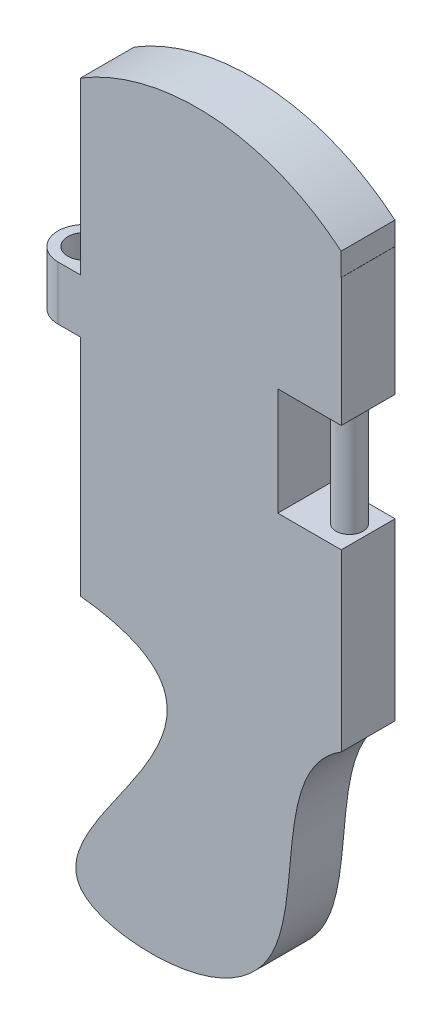
ISO-10303-21;
HEADER;
FILE_DESCRIPTION(('STEP AP214'),'2;1');
FILE_NAME('part.step','',(''),(''),'','','');
FILE_SCHEMA(('AUTOMOTIVE_DESIGN { 1 0 10303 214 1 1 1 1 }'));
ENDSEC;
DATA;
#1=APPLICATION_CONTEXT('core data for automotive mechanical design processes');
#2=APPLICATION_PROTOCOL_DEFINITION('international standard','automotive_design',2000,#1);
#3=PRODUCT_CONTEXT('',#1,'mechanical');
#4=PRODUCT('Part','Part','',(#3));
#5=PRODUCT_RELATED_PRODUCT_CATEGORY('part','',(#4));
#6=PRODUCT_DEFINITION_FORMATION('','',#4);
#7=PRODUCT_DEFINITION_CONTEXT('part definition',#1,'design');
#8=PRODUCT_DEFINITION('design','',#6,#7);
#9=PRODUCT_DEFINITION_SHAPE('','',#8);
#10=(LENGTH_UNIT() NAMED_UNIT(*) SI_UNIT(.MILLI.,.METRE.));
#11=(NAMED_UNIT(*) PLANE_ANGLE_UNIT() SI_UNIT($,.RADIAN.));
#12=(NAMED_UNIT(*) SI_UNIT($,.STERADIAN.) SOLID_ANGLE_UNIT());
#13=UNCERTAINTY_MEASURE_WITH_UNIT(LENGTH_MEASURE(1.E-05),#10,'distance_accuracy_value','');
#14=(GEOMETRIC_REPRESENTATION_CONTEXT(3) GLOBAL_UNCERTAINTY_ASSIGNED_CONTEXT((#13)) GLOBAL_UNIT_ASSIGNED_CONTEXT((#10,
#11,#12)) REPRESENTATION_CONTEXT('',''));
#15=CARTESIAN_POINT('',(0.,0.,0.));
#16=DIRECTION('',(0.,0.,1.));
#17=DIRECTION('',(1.,0.,0.));
#18=AXIS2_PLACEMENT_3D('',#15,#16,#17);
#19=CARTESIAN_POINT('',(0.,0.,6.));
#20=DIRECTION('',(1.,0.,0.));
#21=DIRECTION('',(0.,0.,-1.));
#22=AXIS2_PLACEMENT_3D('',#19,#20,#21);
#23=PLANE('',#22);
#24=DIRECTION('',(0.,0.,-1.));
#25=VECTOR('',#24,1.);
#26=CARTESIAN_POINT('',(0.,31.,0.));
#27=LINE('',#26,#25);
#28=CARTESIAN_POINT('',(0.,31.,6.));
#29=VERTEX_POINT('',#28);
#30=CARTESIAN_POINT('',(0.,31.,0.));
#31=VERTEX_POINT('',#30);
#32=EDGE_CURVE('E236',#29,#31,#27,.T.);
#33=ORIENTED_EDGE('',*,*,#32,.F.);
#34=DIRECTION('',(0.,-1.,0.));
#35=VECTOR('',#34,1.);
#36=CARTESIAN_POINT('',(0.,0.,6.));
#37=LINE('',#36,#35);
#38=CARTESIAN_POINT('',(0.,50.,6.));
#39=VERTEX_POINT('',#38);
#40=EDGE_CURVE('E278',#39,#29,#37,.T.);
#41=ORIENTED_EDGE('',*,*,#40,.F.);
#42=DIRECTION('',(0.,0.,-1.));
#43=VECTOR('',#42,1.);
#44=CARTESIAN_POINT('',(0.,50.,6.));
#45=LINE('',#44,#43);
#46=CARTESIAN_POINT('',(0.,50.,0.));
#47=VERTEX_POINT('',#46);
#48=EDGE_CURVE('E302',#39,#47,#45,.T.);
#49=ORIENTED_EDGE('',*,*,#48,.T.);
#50=DIRECTION('',(0.,-1.,0.));
#51=VECTOR('',#50,1.);
#52=CARTESIAN_POINT('',(0.,0.,0.));
#53=LINE('',#52,#51);
#54=EDGE_CURVE('E272',#47,#31,#53,.T.);
#55=ORIENTED_EDGE('',*,*,#54,.T.);
#56=EDGE_LOOP('',(#33,#41,#49,#55));
#57=FACE_BOUND('',#56,.T.);
#58=ADVANCED_FACE('F44',(#57),#23,.F.);
#59=CARTESIAN_POINT('',(0.,0.,6.));
#60=CARTESIAN_POINT('',(23.8721311751468,-2.7431632315194,6.));
#61=CARTESIAN_POINT('',(-15.1561208225905,-28.8207850670708,6.));
#62=CARTESIAN_POINT('',(12.5644821614038,-31.6224895801647,6.));
#63=CARTESIAN_POINT('',(27.1083698860684,-22.1343962257601,6.));
#64=CARTESIAN_POINT('',(20.6835352250907,-4.60988712947031,6.));
#65=CARTESIAN_POINT('',(30.,0.,6.));
#66=B_SPLINE_CURVE_WITH_KNOTS('',3,(#59,#60,#61,#62,#63,#64,#65),.UNSPECIFIED.,.F.,.F.,(4,1,1,1,
4),(0.,0.411785319319474,0.564960896964419,0.677132612613347,1.),.UNSPECIFIED.);
#67=DIRECTION('',(0.,0.,-1.));
#68=VECTOR('',#67,1.);
#69=SURFACE_OF_LINEAR_EXTRUSION('',#66,#68);
#70=CARTESIAN_POINT('',(0.,0.,0.));
#71=CARTESIAN_POINT('',(23.8721311751468,-2.7431632315194,0.));
#72=CARTESIAN_POINT('',(-15.1561208225905,-28.8207850670708,0.));
#73=CARTESIAN_POINT('',(12.5644821614038,-31.6224895801647,0.));
#74=CARTESIAN_POINT('',(27.1083698860684,-22.1343962257601,0.));
#75=CARTESIAN_POINT('',(20.6835352250907,-4.60988712947031,0.));
#76=CARTESIAN_POINT('',(30.,0.,0.));
#77=B_SPLINE_CURVE_WITH_KNOTS('',3,(#70,#71,#72,#73,#74,#75,#76),.UNSPECIFIED.,.F.,.F.,(4,1,1,1,
4),(0.,0.411785319319474,0.564960896964419,0.677132612613347,1.),.UNSPECIFIED.);
#78=CARTESIAN_POINT('',(0.,0.,0.));
#79=VERTEX_POINT('',#78);
#80=CARTESIAN_POINT('',(29.0752583291039,-0.51259095328322,0.));
#81=VERTEX_POINT('',#80);
#82=EDGE_CURVE('E262',#79,#81,#77,.T.);
#83=ORIENTED_EDGE('',*,*,#82,.T.);
#84=DIRECTION('',(0.,0.,-1.));
#85=VECTOR('',#84,1.);
#86=CARTESIAN_POINT('',(29.0752583291039,-0.51259095324341,6.));
#87=LINE('',#86,#85);
#88=CARTESIAN_POINT('',(29.0752583291039,-0.512590953283237,6.));
#89=VERTEX_POINT('',#88);
#90=EDGE_CURVE('E187',#81,#89,#87,.F.);
#91=ORIENTED_EDGE('',*,*,#90,.T.);
#92=CARTESIAN_POINT('',(0.,0.,6.));
#93=VERTEX_POINT('',#92);
#94=EDGE_CURVE('E264',#93,#89,#66,.T.);
#95=ORIENTED_EDGE('',*,*,#94,.F.);
#96=DIRECTION('',(0.,0.,-1.));
#97=VECTOR('',#96,1.);
#98=CARTESIAN_POINT('',(0.,0.,6.));
#99=LINE('',#98,#97);
#100=EDGE_CURVE('E283',#93,#79,#99,.T.);
#101=ORIENTED_EDGE('',*,*,#100,.T.);
#102=EDGE_LOOP('',(#83,#91,#95,#101));
#103=FACE_BOUND('',#102,.T.);
#104=ADVANCED_FACE('F50',(#103),#69,.F.);
#105=CARTESIAN_POINT('',(13.0155305968896,28.6553059688964,6.));
#106=DIRECTION('',(0.,0.,-1.));
#107=DIRECTION('',(-1.,0.,0.));
#108=AXIS2_PLACEMENT_3D('',#105,#106,#107);
#109=CYLINDRICAL_SURFACE('',#108,25.);
#110=CARTESIAN_POINT('',(13.0155305968896,28.6553059688964,6.));
#111=DIRECTION('',(0.,0.,1.));
#112=DIRECTION('',(-1.,0.,0.));
#113=AXIS2_PLACEMENT_3D('',#110,#111,#112);
#114=CIRCLE('',#113,25.);
#115=CARTESIAN_POINT('',(29.0595753531973,47.8279069363603,6.));
#116=VERTEX_POINT('',#115);
#117=EDGE_CURVE('E275',#116,#39,#114,.T.);
#118=ORIENTED_EDGE('',*,*,#117,.F.);
#119=DIRECTION('',(0.,0.,1.));
#120=VECTOR('',#119,1.);
#121=CARTESIAN_POINT('',(29.0595753531973,47.8279069363603,0.));
#122=LINE('',#121,#120);
#123=CARTESIAN_POINT('',(29.0595753531973,47.8279069363603,0.));
#124=VERTEX_POINT('',#123);
#125=EDGE_CURVE('E154',#124,#116,#122,.T.);
#126=ORIENTED_EDGE('',*,*,#125,.F.);
#127=CARTESIAN_POINT('',(13.0155305968896,28.6553059688964,0.));
#128=DIRECTION('',(0.,0.,1.));
#129=DIRECTION('',(-1.,0.,0.));
#130=AXIS2_PLACEMENT_3D('',#127,#128,#129);
#131=CIRCLE('',#130,25.);
#132=EDGE_CURVE('E170',#124,#47,#131,.T.);
#133=ORIENTED_EDGE('',*,*,#132,.T.);
#134=ORIENTED_EDGE('',*,*,#48,.F.);
#135=EDGE_LOOP('',(#118,#126,#133,#134));
#136=FACE_BOUND('',#135,.T.);
#137=ADVANCED_FACE('F354',(#136),#109,.T.);
#138=CARTESIAN_POINT('',(0.,25.,6.));
#139=VERTEX_POINT('',#138);
#140=EDGE_CURVE('E276',#139,#93,#37,.T.);
#141=ORIENTED_EDGE('',*,*,#140,.F.);
#142=DIRECTION('',(0.,0.,-1.));
#143=VECTOR('',#142,1.);
#144=CARTESIAN_POINT('',(0.,25.,0.));
#145=LINE('',#144,#143);
#146=CARTESIAN_POINT('',(0.,25.,0.));
#147=VERTEX_POINT('',#146);
#148=EDGE_CURVE('E251',#139,#147,#145,.T.);
#149=ORIENTED_EDGE('',*,*,#148,.T.);
#150=EDGE_CURVE('E293',#147,#79,#53,.T.);
#151=ORIENTED_EDGE('',*,*,#150,.T.);
#152=ORIENTED_EDGE('',*,*,#100,.F.);
#153=EDGE_LOOP('',(#141,#149,#151,#152));
#154=FACE_BOUND('',#153,.T.);
#155=ADVANCED_FACE('F346',(#154),#23,.F.);
#156=CARTESIAN_POINT('',(6.33964307279283,-30.5103738589978,6.));
#157=DIRECTION('',(0.,0.,1.));
#158=DIRECTION('',(1.,0.,0.));
#159=AXIS2_PLACEMENT_3D('',#156,#157,#158);
#160=PLANE('',#159);
#161=DIRECTION('',(0.,-1.,0.));
#162=VECTOR('',#161,1.);
#163=CARTESIAN_POINT('',(29.0595753531973,47.8279069363603,6.));
#164=LINE('',#163,#162);
#165=CARTESIAN_POINT('',(29.0595753531973,45.2788571865023,6.));
#166=VERTEX_POINT('',#165);
#167=EDGE_CURVE('E153',#116,#166,#164,.T.);
#168=ORIENTED_EDGE('',*,*,#167,.F.);
#169=ORIENTED_EDGE('',*,*,#117,.T.);
#170=ORIENTED_EDGE('',*,*,#40,.T.);
#171=DIRECTION('',(1.,0.,0.));
#172=VECTOR('',#171,1.);
#173=CARTESIAN_POINT('',(-2.5,31.,6.00000000000001));
#174=LINE('',#173,#172);
#175=CARTESIAN_POINT('',(-2.5,31.,6.00000000000001));
#176=VERTEX_POINT('',#175);
#177=EDGE_CURVE('E233',#176,#29,#174,.T.);
#178=ORIENTED_EDGE('',*,*,#177,.F.);
#179=DIRECTION('',(0.,-1.,0.));
#180=VECTOR('',#179,1.);
#181=CARTESIAN_POINT('',(-2.5,31.,6.00000000000001));
#182=LINE('',#181,#180);
#183=CARTESIAN_POINT('',(-2.5,25.,6.00000000000001));
#184=VERTEX_POINT('',#183);
#185=EDGE_CURVE('E261',#176,#184,#182,.T.);
#186=ORIENTED_EDGE('',*,*,#185,.T.);
#187=DIRECTION('',(1.,0.,0.));
#188=VECTOR('',#187,1.);
#189=CARTESIAN_POINT('',(-2.5,25.,6.00000000000001));
#190=LINE('',#189,#188);
#191=EDGE_CURVE('E249',#184,#139,#190,.T.);
#192=ORIENTED_EDGE('',*,*,#191,.T.);
#193=ORIENTED_EDGE('',*,*,#140,.T.);
#194=ORIENTED_EDGE('',*,*,#94,.T.);
#195=DIRECTION('',(0.,-1.,0.));
#196=VECTOR('',#195,1.);
#197=CARTESIAN_POINT('',(29.0752583291039,47.,6.));
#198=LINE('',#197,#196);
#199=CARTESIAN_POINT('',(29.0752583291039,19.,6.));
#200=VERTEX_POINT('',#199);
#201=EDGE_CURVE('E177',#200,#89,#198,.T.);
#202=ORIENTED_EDGE('',*,*,#201,.F.);
#203=DIRECTION('',(1.,0.,0.));
#204=VECTOR('',#203,1.);
#205=CARTESIAN_POINT('',(30.,19.,6.));
#206=LINE('',#205,#204);
#207=CARTESIAN_POINT('',(22.,19.,6.));
#208=VERTEX_POINT('',#207);
#209=EDGE_CURVE('E198',#208,#200,#206,.T.);
#210=ORIENTED_EDGE('',*,*,#209,.F.);
#211=DIRECTION('',(0.,-1.,0.));
#212=VECTOR('',#211,1.);
#213=CARTESIAN_POINT('',(22.,31.,6.));
#214=LINE('',#213,#212);
#215=CARTESIAN_POINT('',(22.,31.,6.));
#216=VERTEX_POINT('',#215);
#217=EDGE_CURVE('E210',#216,#208,#214,.T.);
#218=ORIENTED_EDGE('',*,*,#217,.F.);
#219=DIRECTION('',(-1.,0.,0.));
#220=VECTOR('',#219,1.);
#221=CARTESIAN_POINT('',(30.,31.,6.));
#222=LINE('',#221,#220);
#223=CARTESIAN_POINT('',(29.0752583291039,31.,6.));
#224=VERTEX_POINT('',#223);
#225=EDGE_CURVE('E192',#224,#216,#222,.T.);
#226=ORIENTED_EDGE('',*,*,#225,.F.);
#227=CARTESIAN_POINT('',(29.0752583291039,45.2788571865023,6.));
#228=VERTEX_POINT('',#227);
#229=EDGE_CURVE('E178',#228,#224,#198,.T.);
#230=ORIENTED_EDGE('',*,*,#229,.F.);
#231=DIRECTION('',(1.,0.,0.));
#232=VECTOR('',#231,1.);
#233=CARTESIAN_POINT('',(29.0595753531973,45.2788571865023,6.));
#234=LINE('',#233,#232);
#235=EDGE_CURVE('E62',#166,#228,#234,.T.);
#236=ORIENTED_EDGE('',*,*,#235,.F.);
#237=EDGE_LOOP('',(#168,#169,#170,#178,#186,#192,#193,#194,#202,#210,#218,#226,#230,#236));
#238=FACE_BOUND('',#237,.T.);
#239=ADVANCED_FACE('F322',(#238),#160,.T.);
#240=CARTESIAN_POINT('',(6.33964307279283,-30.5103738589978,0.));
#241=DIRECTION('',(0.,0.,1.));
#242=DIRECTION('',(1.,0.,0.));
#243=AXIS2_PLACEMENT_3D('',#240,#241,#242);
#244=PLANE('',#243);
#245=ORIENTED_EDGE('',*,*,#132,.F.);
#246=DIRECTION('',(0.,-1.,0.));
#247=VECTOR('',#246,1.);
#248=CARTESIAN_POINT('',(29.0595753531973,47.8279069363603,0.));
#249=LINE('',#248,#247);
#250=CARTESIAN_POINT('',(29.0595753531973,45.2788571865023,0.));
#251=VERTEX_POINT('',#250);
#252=EDGE_CURVE('E147',#124,#251,#249,.T.);
#253=ORIENTED_EDGE('',*,*,#252,.T.);
#254=DIRECTION('',(1.,0.,0.));
#255=VECTOR('',#254,1.);
#256=CARTESIAN_POINT('',(29.0595753531973,45.2788571865023,0.));
#257=LINE('',#256,#255);
#258=CARTESIAN_POINT('',(29.0752583291039,45.2788571865023,0.));
#259=VERTEX_POINT('',#258);
#260=EDGE_CURVE('E156',#251,#259,#257,.T.);
#261=ORIENTED_EDGE('',*,*,#260,.T.);
#262=DIRECTION('',(0.,-1.,0.));
#263=VECTOR('',#262,1.);
#264=CARTESIAN_POINT('',(29.0752583291039,-30.5103738589978,0.));
#265=LINE('',#264,#263);
#266=CARTESIAN_POINT('',(29.0752583291039,31.,0.));
#267=VERTEX_POINT('',#266);
#268=EDGE_CURVE('E182',#259,#267,#265,.T.);
#269=ORIENTED_EDGE('',*,*,#268,.T.);
#270=DIRECTION('',(-1.,0.,0.));
#271=VECTOR('',#270,1.);
#272=CARTESIAN_POINT('',(30.,31.,0.));
#273=LINE('',#272,#271);
#274=CARTESIAN_POINT('',(22.,31.,0.));
#275=VERTEX_POINT('',#274);
#276=EDGE_CURVE('E195',#267,#275,#273,.T.);
#277=ORIENTED_EDGE('',*,*,#276,.T.);
#278=DIRECTION('',(0.,-1.,0.));
#279=VECTOR('',#278,1.);
#280=CARTESIAN_POINT('',(22.,31.,0.));
#281=LINE('',#280,#279);
#282=CARTESIAN_POINT('',(22.,19.,0.));
#283=VERTEX_POINT('',#282);
#284=EDGE_CURVE('E191',#275,#283,#281,.T.);
#285=ORIENTED_EDGE('',*,*,#284,.T.);
#286=DIRECTION('',(1.,0.,0.));
#287=VECTOR('',#286,1.);
#288=CARTESIAN_POINT('',(30.,19.,0.));
#289=LINE('',#288,#287);
#290=CARTESIAN_POINT('',(29.0752583291039,19.,0.));
#291=VERTEX_POINT('',#290);
#292=EDGE_CURVE('E199',#283,#291,#289,.T.);
#293=ORIENTED_EDGE('',*,*,#292,.T.);
#294=EDGE_CURVE('E69',#291,#81,#265,.T.);
#295=ORIENTED_EDGE('',*,*,#294,.T.);
#296=ORIENTED_EDGE('',*,*,#82,.F.);
#297=ORIENTED_EDGE('',*,*,#150,.F.);
#298=DIRECTION('',(-1.,0.,0.));
#299=VECTOR('',#298,1.);
#300=CARTESIAN_POINT('',(-2.5,25.,0.));
#301=LINE('',#300,#299);
#302=CARTESIAN_POINT('',(-2.5,25.,0.));
#303=VERTEX_POINT('',#302);
#304=EDGE_CURVE('E234',#147,#303,#301,.T.);
#305=ORIENTED_EDGE('',*,*,#304,.T.);
#306=DIRECTION('',(0.,-1.,0.));
#307=VECTOR('',#306,1.);
#308=CARTESIAN_POINT('',(-2.5,31.,0.));
#309=LINE('',#308,#307);
#310=CARTESIAN_POINT('',(-2.5,31.,0.));
#311=VERTEX_POINT('',#310);
#312=EDGE_CURVE('E245',#311,#303,#309,.T.);
#313=ORIENTED_EDGE('',*,*,#312,.F.);
#314=DIRECTION('',(-1.,0.,0.));
#315=VECTOR('',#314,1.);
#316=CARTESIAN_POINT('',(-2.5,31.,0.));
#317=LINE('',#316,#315);
#318=EDGE_CURVE('E242',#31,#311,#317,.T.);
#319=ORIENTED_EDGE('',*,*,#318,.F.);
#320=ORIENTED_EDGE('',*,*,#54,.F.);
#321=EDGE_LOOP('',(#245,#253,#261,#269,#277,#285,#293,#295,#296,#297,#305,#313,#319,#320));
#322=FACE_BOUND('',#321,.T.);
#323=ADVANCED_FACE('F164',(#322),#244,.F.);
#324=CARTESIAN_POINT('',(-2.5,31.,3.00000000000001));
#325=DIRECTION('',(0.,-1.,0.));
#326=DIRECTION('',(0.,0.,-1.));
#327=AXIS2_PLACEMENT_3D('',#324,#325,#326);
#328=CYLINDRICAL_SURFACE('',#327,3.00000000000001);
#329=CARTESIAN_POINT('',(-2.5,25.,3.00000000000001));
#330=DIRECTION('',(0.,1.,0.));
#331=DIRECTION('',(0.,0.,1.));
#332=AXIS2_PLACEMENT_3D('',#329,#330,#331);
#333=CIRCLE('',#332,3.00000000000001);
#334=EDGE_CURVE('E223',#303,#184,#333,.T.);
#335=ORIENTED_EDGE('',*,*,#334,.T.);
#336=ORIENTED_EDGE('',*,*,#185,.F.);
#337=CARTESIAN_POINT('',(-2.5,31.,3.00000000000001));
#338=DIRECTION('',(0.,1.,0.));
#339=DIRECTION('',(0.,0.,1.));
#340=AXIS2_PLACEMENT_3D('',#337,#338,#339);
#341=CIRCLE('',#340,3.00000000000001);
#342=EDGE_CURVE('E228',#311,#176,#341,.T.);
#343=ORIENTED_EDGE('',*,*,#342,.F.);
#344=ORIENTED_EDGE('',*,*,#312,.T.);
#345=EDGE_LOOP('',(#335,#336,#343,#344));
#346=FACE_BOUND('',#345,.T.);
#347=ADVANCED_FACE('F377',(#346),#328,.T.);
#348=CARTESIAN_POINT('',(-2.5,31.,3.00000000000001));
#349=DIRECTION('',(0.,1.,0.));
#350=DIRECTION('',(0.,0.,1.));
#351=AXIS2_PLACEMENT_3D('',#348,#349,#350);
#352=PLANE('',#351);
#353=CARTESIAN_POINT('',(-2.5,31.,3.));
#354=DIRECTION('',(0.,1.,0.));
#355=DIRECTION('',(0.,0.,1.));
#356=AXIS2_PLACEMENT_3D('',#353,#354,#355);
#357=CIRCLE('',#356,1.9);
#358=CARTESIAN_POINT('',(-2.5,31.,4.9));
#359=VERTEX_POINT('',#358);
#360=EDGE_CURVE('E220',#359,#359,#357,.T.);
#361=ORIENTED_EDGE('',*,*,#360,.F.);
#362=EDGE_LOOP('',(#361));
#363=FACE_BOUND('',#362,.T.);
#364=ORIENTED_EDGE('',*,*,#342,.T.);
#365=ORIENTED_EDGE('',*,*,#177,.T.);
#366=ORIENTED_EDGE('',*,*,#32,.T.);
#367=ORIENTED_EDGE('',*,*,#318,.T.);
#368=EDGE_LOOP('',(#364,#365,#366,#367));
#369=FACE_BOUND('',#368,.T.);
#370=ADVANCED_FACE('F381',(#363,#369),#352,.T.);
#371=CARTESIAN_POINT('',(-2.5,25.,3.00000000000001));
#372=DIRECTION('',(0.,1.,0.));
#373=DIRECTION('',(0.,0.,1.));
#374=AXIS2_PLACEMENT_3D('',#371,#372,#373);
#375=PLANE('',#374);
#376=CARTESIAN_POINT('',(-2.5,25.,3.));
#377=DIRECTION('',(0.,1.,0.));
#378=DIRECTION('',(0.,0.,1.));
#379=AXIS2_PLACEMENT_3D('',#376,#377,#378);
#380=CIRCLE('',#379,1.9);
#381=CARTESIAN_POINT('',(-2.5,25.,4.9));
#382=VERTEX_POINT('',#381);
#383=EDGE_CURVE('E222',#382,#382,#380,.T.);
#384=ORIENTED_EDGE('',*,*,#383,.T.);
#385=EDGE_LOOP('',(#384));
#386=FACE_BOUND('',#385,.T.);
#387=ORIENTED_EDGE('',*,*,#334,.F.);
#388=ORIENTED_EDGE('',*,*,#304,.F.);
#389=ORIENTED_EDGE('',*,*,#148,.F.);
#390=ORIENTED_EDGE('',*,*,#191,.F.);
#391=EDGE_LOOP('',(#387,#388,#389,#390));
#392=FACE_BOUND('',#391,.T.);
#393=ADVANCED_FACE('F373',(#386,#392),#375,.F.);
#394=CARTESIAN_POINT('',(-2.5,25.,3.));
#395=DIRECTION('',(0.,1.,0.));
#396=DIRECTION('',(0.,0.,1.));
#397=AXIS2_PLACEMENT_3D('',#394,#395,#396);
#398=CYLINDRICAL_SURFACE('',#397,1.9);
#399=ORIENTED_EDGE('',*,*,#383,.F.);
#400=EDGE_LOOP('',(#399));
#401=FACE_BOUND('',#400,.T.);
#402=ORIENTED_EDGE('',*,*,#360,.T.);
#403=EDGE_LOOP('',(#402));
#404=FACE_BOUND('',#403,.T.);
#405=ADVANCED_FACE('F391',(#401,#404),#398,.F.);
#406=CARTESIAN_POINT('',(30.,19.,0.));
#407=DIRECTION('',(0.,-1.,0.));
#408=DIRECTION('',(0.,0.,-1.));
#409=AXIS2_PLACEMENT_3D('',#406,#407,#408);
#410=PLANE('',#409);
#411=CARTESIAN_POINT('',(27.,19.,3.));
#412=DIRECTION('',(0.,-1.,0.));
#413=DIRECTION('',(0.,0.,-1.));
#414=AXIS2_PLACEMENT_3D('',#411,#412,#413);
#415=CIRCLE('',#414,1.5);
#416=CARTESIAN_POINT('',(27.,19.,1.5));
#417=VERTEX_POINT('',#416);
#418=EDGE_CURVE('E310',#417,#417,#415,.F.);
#419=ORIENTED_EDGE('',*,*,#418,.F.);
#420=EDGE_LOOP('',(#419));
#421=FACE_BOUND('',#420,.T.);
#422=ORIENTED_EDGE('',*,*,#209,.T.);
#423=DIRECTION('',(0.,0.,-1.));
#424=VECTOR('',#423,1.);
#425=CARTESIAN_POINT('',(29.0752583291039,19.,0.));
#426=LINE('',#425,#424);
#427=EDGE_CURVE('E184',#200,#291,#426,.T.);
#428=ORIENTED_EDGE('',*,*,#427,.T.);
#429=ORIENTED_EDGE('',*,*,#292,.F.);
#430=DIRECTION('',(0.,0.,1.));
#431=VECTOR('',#430,1.);
#432=CARTESIAN_POINT('',(22.,19.,0.));
#433=LINE('',#432,#431);
#434=EDGE_CURVE('E212',#283,#208,#433,.T.);
#435=ORIENTED_EDGE('',*,*,#434,.T.);
#436=EDGE_LOOP('',(#422,#428,#429,#435));
#437=FACE_BOUND('',#436,.T.);
#438=ADVANCED_FACE('F435',(#421,#437),#410,.F.);
#439=CARTESIAN_POINT('',(22.,31.,0.));
#440=DIRECTION('',(-1.,0.,0.));
#441=DIRECTION('',(0.,0.,1.));
#442=AXIS2_PLACEMENT_3D('',#439,#440,#441);
#443=PLANE('',#442);
#444=ORIENTED_EDGE('',*,*,#217,.T.);
#445=ORIENTED_EDGE('',*,*,#434,.F.);
#446=ORIENTED_EDGE('',*,*,#284,.F.);
#447=DIRECTION('',(0.,0.,1.));
#448=VECTOR('',#447,1.);
#449=CARTESIAN_POINT('',(22.,31.,0.));
#450=LINE('',#449,#448);
#451=EDGE_CURVE('E204',#275,#216,#450,.T.);
#452=ORIENTED_EDGE('',*,*,#451,.T.);
#453=EDGE_LOOP('',(#444,#445,#446,#452));
#454=FACE_BOUND('',#453,.T.);
#455=ADVANCED_FACE('F328',(#454),#443,.F.);
#456=CARTESIAN_POINT('',(30.,31.,0.));
#457=DIRECTION('',(0.,1.,0.));
#458=DIRECTION('',(0.,0.,1.));
#459=AXIS2_PLACEMENT_3D('',#456,#457,#458);
#460=PLANE('',#459);
#461=CARTESIAN_POINT('',(27.,31.,3.));
#462=DIRECTION('',(0.,1.,0.));
#463=DIRECTION('',(0.,0.,1.));
#464=AXIS2_PLACEMENT_3D('',#461,#462,#463);
#465=CIRCLE('',#464,1.5);
#466=CARTESIAN_POINT('',(27.,31.,4.5));
#467=VERTEX_POINT('',#466);
#468=EDGE_CURVE('E301',#467,#467,#465,.F.);
#469=ORIENTED_EDGE('',*,*,#468,.F.);
#470=EDGE_LOOP('',(#469));
#471=FACE_BOUND('',#470,.T.);
#472=ORIENTED_EDGE('',*,*,#276,.F.);
#473=DIRECTION('',(0.,0.,1.));
#474=VECTOR('',#473,1.);
#475=CARTESIAN_POINT('',(29.0752583291039,31.,0.));
#476=LINE('',#475,#474);
#477=EDGE_CURVE('E54',#267,#224,#476,.T.);
#478=ORIENTED_EDGE('',*,*,#477,.T.);
#479=ORIENTED_EDGE('',*,*,#225,.T.);
#480=ORIENTED_EDGE('',*,*,#451,.F.);
#481=EDGE_LOOP('',(#472,#478,#479,#480));
#482=FACE_BOUND('',#481,.T.);
#483=ADVANCED_FACE('F318',(#471,#482),#460,.F.);
#484=CARTESIAN_POINT('',(27.,53.6573059688964,3.));
#485=DIRECTION('',(0.,-1.,0.));
#486=DIRECTION('',(0.,0.,-1.));
#487=AXIS2_PLACEMENT_3D('',#484,#485,#486);
#488=CYLINDRICAL_SURFACE('',#487,1.5);
#489=ORIENTED_EDGE('',*,*,#418,.T.);
#490=EDGE_LOOP('',(#489));
#491=FACE_BOUND('',#490,.T.);
#492=ORIENTED_EDGE('',*,*,#468,.T.);
#493=EDGE_LOOP('',(#492));
#494=FACE_BOUND('',#493,.T.);
#495=ADVANCED_FACE('F331',(#491,#494),#488,.T.);
#496=CARTESIAN_POINT('',(29.0752583291039,47.,-4.));
#497=DIRECTION('',(-1.,0.,0.));
#498=DIRECTION('',(0.,-1.,0.));
#499=AXIS2_PLACEMENT_3D('',#496,#497,#498);
#500=PLANE('',#499);
#501=ORIENTED_EDGE('',*,*,#268,.F.);
#502=DIRECTION('',(0.,0.,1.));
#503=VECTOR('',#502,1.);
#504=CARTESIAN_POINT('',(29.0752583291039,45.2788571865023,-4.));
#505=LINE('',#504,#503);
#506=EDGE_CURVE('E11',#259,#228,#505,.T.);
#507=ORIENTED_EDGE('',*,*,#506,.T.);
#508=ORIENTED_EDGE('',*,*,#229,.T.);
#509=ORIENTED_EDGE('',*,*,#477,.F.);
#510=EDGE_LOOP('',(#501,#507,#508,#509));
#511=FACE_BOUND('',#510,.T.);
#512=ADVANCED_FACE('F332',(#511),#500,.F.);
#513=ORIENTED_EDGE('',*,*,#294,.F.);
#514=ORIENTED_EDGE('',*,*,#427,.F.);
#515=ORIENTED_EDGE('',*,*,#201,.T.);
#516=ORIENTED_EDGE('',*,*,#90,.F.);
#517=EDGE_LOOP('',(#513,#514,#515,#516));
#518=FACE_BOUND('',#517,.T.);
#519=ADVANCED_FACE('F334',(#518),#500,.F.);
#520=CARTESIAN_POINT('',(29.0595753531973,45.2788571865023,0.));
#521=DIRECTION('',(0.,-1.,0.));
#522=DIRECTION('',(0.,0.,-1.));
#523=AXIS2_PLACEMENT_3D('',#520,#521,#522);
#524=PLANE('',#523);
#525=ORIENTED_EDGE('',*,*,#260,.F.);
#526=DIRECTION('',(0.,0.,1.));
#527=VECTOR('',#526,1.);
#528=CARTESIAN_POINT('',(29.0595753531973,45.2788571865023,0.));
#529=LINE('',#528,#527);
#530=EDGE_CURVE('E148',#251,#166,#529,.T.);
#531=ORIENTED_EDGE('',*,*,#530,.T.);
#532=ORIENTED_EDGE('',*,*,#235,.T.);
#533=ORIENTED_EDGE('',*,*,#506,.F.);
#534=EDGE_LOOP('',(#525,#531,#532,#533));
#535=FACE_BOUND('',#534,.T.);
#536=ADVANCED_FACE('F157',(#535),#524,.F.);
#537=CARTESIAN_POINT('',(29.0595753531973,47.8279069363603,0.));
#538=DIRECTION('',(-1.,0.,0.));
#539=DIRECTION('',(0.,0.,1.));
#540=AXIS2_PLACEMENT_3D('',#537,#538,#539);
#541=PLANE('',#540);
#542=ORIENTED_EDGE('',*,*,#167,.T.);
#543=ORIENTED_EDGE('',*,*,#530,.F.);
#544=ORIENTED_EDGE('',*,*,#252,.F.);
#545=ORIENTED_EDGE('',*,*,#125,.T.);
#546=EDGE_LOOP('',(#542,#543,#544,#545));
#547=FACE_BOUND('',#546,.T.);
#548=ADVANCED_FACE('F146',(#547),#541,.F.);
#549=CLOSED_SHELL('',(#58,#104,#137,#155,#239,#323,#347,#370,#393,#405,#438,#455,#483,#495,#512,
#519,#536,#548));
#550=MANIFOLD_SOLID_BREP('B2',#549);
#551=ADVANCED_BREP_SHAPE_REPRESENTATION('',(#18,#550),#14);
#552=SHAPE_DEFINITION_REPRESENTATION(#9,#551);
ENDSEC;
END-ISO-10303-21;
